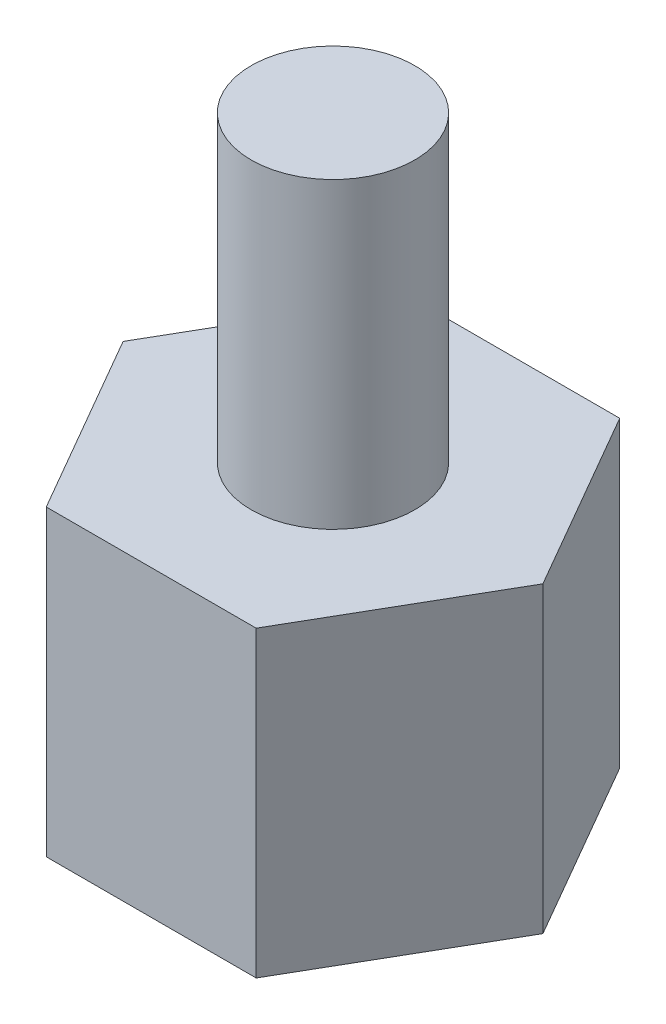
ISO-10303-21;
HEADER;
FILE_DESCRIPTION(('STEP AP214'),'2;1');
FILE_NAME('part.step','',(''),(''),'','','');
FILE_SCHEMA(('AUTOMOTIVE_DESIGN { 1 0 10303 214 1 1 1 1 }'));
ENDSEC;
DATA;
#1=APPLICATION_CONTEXT('core data for automotive mechanical design processes');
#2=APPLICATION_PROTOCOL_DEFINITION('international standard','automotive_design',2000,#1);
#3=PRODUCT_CONTEXT('',#1,'mechanical');
#4=PRODUCT('Part','Part','',(#3));
#5=PRODUCT_RELATED_PRODUCT_CATEGORY('part','',(#4));
#6=PRODUCT_DEFINITION_FORMATION('','',#4);
#7=PRODUCT_DEFINITION_CONTEXT('part definition',#1,'design');
#8=PRODUCT_DEFINITION('design','',#6,#7);
#9=PRODUCT_DEFINITION_SHAPE('','',#8);
#10=(LENGTH_UNIT() NAMED_UNIT(*) SI_UNIT(.MILLI.,.METRE.));
#11=(NAMED_UNIT(*) PLANE_ANGLE_UNIT() SI_UNIT($,.RADIAN.));
#12=(NAMED_UNIT(*) SI_UNIT($,.STERADIAN.) SOLID_ANGLE_UNIT());
#13=UNCERTAINTY_MEASURE_WITH_UNIT(LENGTH_MEASURE(1.E-05),#10,'distance_accuracy_value','');
#14=(GEOMETRIC_REPRESENTATION_CONTEXT(3) GLOBAL_UNCERTAINTY_ASSIGNED_CONTEXT((#13)) GLOBAL_UNIT_ASSIGNED_CONTEXT((#10,
#11,#12)) REPRESENTATION_CONTEXT('',''));
#15=CARTESIAN_POINT('',(0.,0.,0.));
#16=DIRECTION('',(0.,0.,1.));
#17=DIRECTION('',(1.,0.,0.));
#18=AXIS2_PLACEMENT_3D('',#15,#16,#17);
#19=CARTESIAN_POINT('',(1.73205080756891,5.,2.99999999999998));
#20=DIRECTION('',(-0.866025403784442,0.,-0.499999999999995));
#21=DIRECTION('',(-0.499999999999995,0.,0.866025403784442));
#22=AXIS2_PLACEMENT_3D('',#19,#20,#21);
#23=PLANE('',#22);
#24=DIRECTION('',(0.499999999999995,0.,-0.866025403784442));
#25=VECTOR('',#24,1.);
#26=CARTESIAN_POINT('',(1.73205080756891,0.,2.99999999999998));
#27=LINE('',#26,#25);
#28=CARTESIAN_POINT('',(1.73205080756891,0.,2.99999999999998));
#29=VERTEX_POINT('',#28);
#30=CARTESIAN_POINT('',(3.46410161513776,0.,0.));
#31=VERTEX_POINT('',#30);
#32=EDGE_CURVE('E130',#29,#31,#27,.T.);
#33=ORIENTED_EDGE('',*,*,#32,.T.);
#34=DIRECTION('',(0.,-1.,0.));
#35=VECTOR('',#34,1.);
#36=CARTESIAN_POINT('',(3.46410161513776,5.,0.));
#37=LINE('',#36,#35);
#38=CARTESIAN_POINT('',(3.46410161513776,5.,0.));
#39=VERTEX_POINT('',#38);
#40=EDGE_CURVE('E42',#39,#31,#37,.T.);
#41=ORIENTED_EDGE('',*,*,#40,.F.);
#42=DIRECTION('',(0.499999999999995,0.,-0.866025403784442));
#43=VECTOR('',#42,1.);
#44=CARTESIAN_POINT('',(1.73205080756891,5.,2.99999999999998));
#45=LINE('',#44,#43);
#46=CARTESIAN_POINT('',(1.73205080756891,5.,2.99999999999998));
#47=VERTEX_POINT('',#46);
#48=EDGE_CURVE('E147',#47,#39,#45,.T.);
#49=ORIENTED_EDGE('',*,*,#48,.F.);
#50=DIRECTION('',(0.,-1.,0.));
#51=VECTOR('',#50,1.);
#52=CARTESIAN_POINT('',(1.73205080756891,5.,2.99999999999998));
#53=LINE('',#52,#51);
#54=EDGE_CURVE('E126',#47,#29,#53,.T.);
#55=ORIENTED_EDGE('',*,*,#54,.T.);
#56=EDGE_LOOP('',(#33,#41,#49,#55));
#57=FACE_BOUND('',#56,.T.);
#58=ADVANCED_FACE('F39',(#57),#23,.F.);
#59=CARTESIAN_POINT('',(3.46410161513776,5.,0.));
#60=DIRECTION('',(-0.866025403784438,0.,0.500000000000001));
#61=DIRECTION('',(0.500000000000001,0.,0.866025403784438));
#62=AXIS2_PLACEMENT_3D('',#59,#60,#61);
#63=PLANE('',#62);
#64=DIRECTION('',(-0.500000000000001,0.,-0.866025403784438));
#65=VECTOR('',#64,1.);
#66=CARTESIAN_POINT('',(3.46410161513776,0.,0.));
#67=LINE('',#66,#65);
#68=CARTESIAN_POINT('',(1.73205080756887,0.,-3.00000000000001));
#69=VERTEX_POINT('',#68);
#70=EDGE_CURVE('E134',#31,#69,#67,.T.);
#71=ORIENTED_EDGE('',*,*,#70,.T.);
#72=DIRECTION('',(0.,-1.,0.));
#73=VECTOR('',#72,1.);
#74=CARTESIAN_POINT('',(1.73205080756887,5.,-3.00000000000001));
#75=LINE('',#74,#73);
#76=CARTESIAN_POINT('',(1.73205080756887,5.,-3.00000000000001));
#77=VERTEX_POINT('',#76);
#78=EDGE_CURVE('E153',#77,#69,#75,.T.);
#79=ORIENTED_EDGE('',*,*,#78,.F.);
#80=DIRECTION('',(-0.500000000000001,0.,-0.866025403784438));
#81=VECTOR('',#80,1.);
#82=CARTESIAN_POINT('',(3.46410161513776,5.,0.));
#83=LINE('',#82,#81);
#84=EDGE_CURVE('E95',#39,#77,#83,.T.);
#85=ORIENTED_EDGE('',*,*,#84,.F.);
#86=ORIENTED_EDGE('',*,*,#40,.T.);
#87=EDGE_LOOP('',(#71,#79,#85,#86));
#88=FACE_BOUND('',#87,.T.);
#89=ADVANCED_FACE('F160',(#88),#63,.F.);
#90=CARTESIAN_POINT('',(1.73205080756887,5.,-3.00000000000001));
#91=DIRECTION('',(0.,0.,1.));
#92=DIRECTION('',(1.,0.,0.));
#93=AXIS2_PLACEMENT_3D('',#90,#91,#92);
#94=PLANE('',#93);
#95=DIRECTION('',(-1.,0.,0.));
#96=VECTOR('',#95,1.);
#97=CARTESIAN_POINT('',(1.73205080756887,0.,-3.00000000000001));
#98=LINE('',#97,#96);
#99=CARTESIAN_POINT('',(-1.73205080756889,0.,-2.99999999999999));
#100=VERTEX_POINT('',#99);
#101=EDGE_CURVE('E138',#69,#100,#98,.T.);
#102=ORIENTED_EDGE('',*,*,#101,.T.);
#103=DIRECTION('',(0.,-1.,0.));
#104=VECTOR('',#103,1.);
#105=CARTESIAN_POINT('',(-1.73205080756889,5.,-2.99999999999999));
#106=LINE('',#105,#104);
#107=CARTESIAN_POINT('',(-1.73205080756889,5.,-2.99999999999999));
#108=VERTEX_POINT('',#107);
#109=EDGE_CURVE('E119',#108,#100,#106,.T.);
#110=ORIENTED_EDGE('',*,*,#109,.F.);
#111=DIRECTION('',(-1.,0.,0.));
#112=VECTOR('',#111,1.);
#113=CARTESIAN_POINT('',(1.73205080756887,5.,-3.00000000000001));
#114=LINE('',#113,#112);
#115=EDGE_CURVE('E108',#77,#108,#114,.T.);
#116=ORIENTED_EDGE('',*,*,#115,.F.);
#117=ORIENTED_EDGE('',*,*,#78,.T.);
#118=EDGE_LOOP('',(#102,#110,#116,#117));
#119=FACE_BOUND('',#118,.T.);
#120=ADVANCED_FACE('F166',(#119),#94,.F.);
#121=CARTESIAN_POINT('',(-1.73205080756889,5.,-2.99999999999999));
#122=DIRECTION('',(0.866025403784442,0.,0.499999999999995));
#123=DIRECTION('',(0.499999999999995,0.,-0.866025403784442));
#124=AXIS2_PLACEMENT_3D('',#121,#122,#123);
#125=PLANE('',#124);
#126=DIRECTION('',(-0.499999999999995,0.,0.866025403784442));
#127=VECTOR('',#126,1.);
#128=CARTESIAN_POINT('',(-1.73205080756889,0.,-2.99999999999999));
#129=LINE('',#128,#127);
#130=CARTESIAN_POINT('',(-3.46410161513776,0.,0.));
#131=VERTEX_POINT('',#130);
#132=EDGE_CURVE('E117',#100,#131,#129,.T.);
#133=ORIENTED_EDGE('',*,*,#132,.T.);
#134=DIRECTION('',(0.,-1.,0.));
#135=VECTOR('',#134,1.);
#136=CARTESIAN_POINT('',(-3.46410161513776,5.,0.));
#137=LINE('',#136,#135);
#138=CARTESIAN_POINT('',(-3.46410161513776,5.,0.));
#139=VERTEX_POINT('',#138);
#140=EDGE_CURVE('E114',#139,#131,#137,.T.);
#141=ORIENTED_EDGE('',*,*,#140,.F.);
#142=DIRECTION('',(-0.499999999999995,0.,0.866025403784442));
#143=VECTOR('',#142,1.);
#144=CARTESIAN_POINT('',(-1.73205080756889,5.,-2.99999999999999));
#145=LINE('',#144,#143);
#146=EDGE_CURVE('E102',#108,#139,#145,.T.);
#147=ORIENTED_EDGE('',*,*,#146,.F.);
#148=ORIENTED_EDGE('',*,*,#109,.T.);
#149=EDGE_LOOP('',(#133,#141,#147,#148));
#150=FACE_BOUND('',#149,.T.);
#151=ADVANCED_FACE('F115',(#150),#125,.F.);
#152=CARTESIAN_POINT('',(-3.46410161513776,5.,0.));
#153=DIRECTION('',(0.866025403784435,0.,-0.500000000000007));
#154=DIRECTION('',(-0.500000000000007,0.,-0.866025403784435));
#155=AXIS2_PLACEMENT_3D('',#152,#153,#154);
#156=PLANE('',#155);
#157=DIRECTION('',(0.500000000000007,0.,0.866025403784434));
#158=VECTOR('',#157,1.);
#159=CARTESIAN_POINT('',(-3.46410161513776,0.,0.));
#160=LINE('',#159,#158);
#161=CARTESIAN_POINT('',(-1.73205080756885,0.,3.00000000000002));
#162=VERTEX_POINT('',#161);
#163=EDGE_CURVE('E80',#131,#162,#160,.T.);
#164=ORIENTED_EDGE('',*,*,#163,.T.);
#165=DIRECTION('',(0.,-1.,0.));
#166=VECTOR('',#165,1.);
#167=CARTESIAN_POINT('',(-1.73205080756885,5.,3.00000000000002));
#168=LINE('',#167,#166);
#169=CARTESIAN_POINT('',(-1.73205080756885,5.,3.00000000000002));
#170=VERTEX_POINT('',#169);
#171=EDGE_CURVE('E120',#170,#162,#168,.T.);
#172=ORIENTED_EDGE('',*,*,#171,.F.);
#173=DIRECTION('',(0.500000000000007,0.,0.866025403784434));
#174=VECTOR('',#173,1.);
#175=CARTESIAN_POINT('',(-3.46410161513776,5.,0.));
#176=LINE('',#175,#174);
#177=EDGE_CURVE('E106',#139,#170,#176,.T.);
#178=ORIENTED_EDGE('',*,*,#177,.F.);
#179=ORIENTED_EDGE('',*,*,#140,.T.);
#180=EDGE_LOOP('',(#164,#172,#178,#179));
#181=FACE_BOUND('',#180,.T.);
#182=ADVANCED_FACE('F122',(#181),#156,.F.);
#183=CARTESIAN_POINT('',(-1.73205080756885,5.,3.00000000000002));
#184=DIRECTION('',(0.,0.,-1.));
#185=DIRECTION('',(-1.,0.,0.));
#186=AXIS2_PLACEMENT_3D('',#183,#184,#185);
#187=PLANE('',#186);
#188=DIRECTION('',(1.,0.,0.));
#189=VECTOR('',#188,1.);
#190=CARTESIAN_POINT('',(-1.73205080756885,0.,3.00000000000002));
#191=LINE('',#190,#189);
#192=EDGE_CURVE('E86',#162,#29,#191,.T.);
#193=ORIENTED_EDGE('',*,*,#192,.T.);
#194=ORIENTED_EDGE('',*,*,#54,.F.);
#195=DIRECTION('',(1.,0.,0.));
#196=VECTOR('',#195,1.);
#197=CARTESIAN_POINT('',(-1.73205080756885,5.,3.00000000000002));
#198=LINE('',#197,#196);
#199=EDGE_CURVE('E57',#170,#47,#198,.T.);
#200=ORIENTED_EDGE('',*,*,#199,.F.);
#201=ORIENTED_EDGE('',*,*,#171,.T.);
#202=EDGE_LOOP('',(#193,#194,#200,#201));
#203=FACE_BOUND('',#202,.T.);
#204=ADVANCED_FACE('F203',(#203),#187,.F.);
#205=CARTESIAN_POINT('',(0.,5.,0.));
#206=DIRECTION('',(0.,1.,0.));
#207=DIRECTION('',(0.,0.,1.));
#208=AXIS2_PLACEMENT_3D('',#205,#206,#207);
#209=PLANE('',#208);
#210=CARTESIAN_POINT('',(0.,5.,0.));
#211=DIRECTION('',(0.,1.,0.));
#212=DIRECTION('',(0.,0.,1.));
#213=AXIS2_PLACEMENT_3D('',#210,#211,#212);
#214=CIRCLE('',#213,1.35);
#215=CARTESIAN_POINT('',(0.,5.,1.35));
#216=VERTEX_POINT('',#215);
#217=EDGE_CURVE('E11',#216,#216,#214,.T.);
#218=ORIENTED_EDGE('',*,*,#217,.F.);
#219=EDGE_LOOP('',(#218));
#220=FACE_BOUND('',#219,.T.);
#221=ORIENTED_EDGE('',*,*,#48,.T.);
#222=ORIENTED_EDGE('',*,*,#84,.T.);
#223=ORIENTED_EDGE('',*,*,#115,.T.);
#224=ORIENTED_EDGE('',*,*,#146,.T.);
#225=ORIENTED_EDGE('',*,*,#177,.T.);
#226=ORIENTED_EDGE('',*,*,#199,.T.);
#227=EDGE_LOOP('',(#221,#222,#223,#224,#225,#226));
#228=FACE_BOUND('',#227,.T.);
#229=ADVANCED_FACE('F104',(#220,#228),#209,.T.);
#230=CARTESIAN_POINT('',(0.,0.,0.));
#231=DIRECTION('',(0.,1.,0.));
#232=DIRECTION('',(0.,0.,1.));
#233=AXIS2_PLACEMENT_3D('',#230,#231,#232);
#234=PLANE('',#233);
#235=CARTESIAN_POINT('',(0.,0.,0.));
#236=DIRECTION('',(0.,-1.,0.));
#237=DIRECTION('',(0.,0.,-1.));
#238=AXIS2_PLACEMENT_3D('',#235,#236,#237);
#239=CIRCLE('',#238,1.35);
#240=CARTESIAN_POINT('',(0.,0.,-1.35));
#241=VERTEX_POINT('',#240);
#242=EDGE_CURVE('E177',#241,#241,#239,.T.);
#243=ORIENTED_EDGE('',*,*,#242,.F.);
#244=EDGE_LOOP('',(#243));
#245=FACE_BOUND('',#244,.T.);
#246=ORIENTED_EDGE('',*,*,#32,.F.);
#247=ORIENTED_EDGE('',*,*,#192,.F.);
#248=ORIENTED_EDGE('',*,*,#163,.F.);
#249=ORIENTED_EDGE('',*,*,#132,.F.);
#250=ORIENTED_EDGE('',*,*,#101,.F.);
#251=ORIENTED_EDGE('',*,*,#70,.F.);
#252=EDGE_LOOP('',(#246,#247,#248,#249,#250,#251));
#253=FACE_BOUND('',#252,.T.);
#254=ADVANCED_FACE('F165',(#245,#253),#234,.F.);
#255=CARTESIAN_POINT('',(0.,10.,0.));
#256=DIRECTION('',(0.,-1.,0.));
#257=DIRECTION('',(0.,0.,-1.));
#258=AXIS2_PLACEMENT_3D('',#255,#256,#257);
#259=CYLINDRICAL_SURFACE('',#258,1.35);
#260=CARTESIAN_POINT('',(0.,10.,0.));
#261=DIRECTION('',(0.,1.,0.));
#262=DIRECTION('',(0.,0.,1.));
#263=AXIS2_PLACEMENT_3D('',#260,#261,#262);
#264=CIRCLE('',#263,1.35);
#265=CARTESIAN_POINT('',(0.,10.,1.35));
#266=VERTEX_POINT('',#265);
#267=EDGE_CURVE('E135',#266,#266,#264,.T.);
#268=ORIENTED_EDGE('',*,*,#267,.F.);
#269=EDGE_LOOP('',(#268));
#270=FACE_BOUND('',#269,.T.);
#271=ORIENTED_EDGE('',*,*,#217,.T.);
#272=EDGE_LOOP('',(#271));
#273=FACE_BOUND('',#272,.T.);
#274=ADVANCED_FACE('F195',(#270,#273),#259,.T.);
#275=CARTESIAN_POINT('',(0.,10.,0.));
#276=DIRECTION('',(0.,1.,0.));
#277=DIRECTION('',(0.,0.,1.));
#278=AXIS2_PLACEMENT_3D('',#275,#276,#277);
#279=PLANE('',#278);
#280=ORIENTED_EDGE('',*,*,#267,.T.);
#281=EDGE_LOOP('',(#280));
#282=FACE_BOUND('',#281,.T.);
#283=ADVANCED_FACE('F190',(#282),#279,.T.);
#284=CARTESIAN_POINT('',(0.,4.,0.));
#285=DIRECTION('',(0.,-1.,0.));
#286=DIRECTION('',(0.,0.,-1.));
#287=AXIS2_PLACEMENT_3D('',#284,#285,#286);
#288=CYLINDRICAL_SURFACE('',#287,1.35);
#289=CARTESIAN_POINT('',(0.,4.,0.));
#290=DIRECTION('',(0.,-1.,0.));
#291=DIRECTION('',(0.,0.,-1.));
#292=AXIS2_PLACEMENT_3D('',#289,#290,#291);
#293=CIRCLE('',#292,1.35);
#294=CARTESIAN_POINT('',(0.,4.,-1.35));
#295=VERTEX_POINT('',#294);
#296=EDGE_CURVE('E176',#295,#295,#293,.T.);
#297=ORIENTED_EDGE('',*,*,#296,.F.);
#298=EDGE_LOOP('',(#297));
#299=FACE_BOUND('',#298,.T.);
#300=ORIENTED_EDGE('',*,*,#242,.T.);
#301=EDGE_LOOP('',(#300));
#302=FACE_BOUND('',#301,.T.);
#303=ADVANCED_FACE('F187',(#299,#302),#288,.F.);
#304=CARTESIAN_POINT('',(0.,4.,0.));
#305=DIRECTION('',(0.,-1.,0.));
#306=DIRECTION('',(0.,0.,-1.));
#307=AXIS2_PLACEMENT_3D('',#304,#305,#306);
#308=PLANE('',#307);
#309=ORIENTED_EDGE('',*,*,#296,.T.);
#310=EDGE_LOOP('',(#309));
#311=FACE_BOUND('',#310,.T.);
#312=ADVANCED_FACE('F185',(#311),#308,.T.);
#313=CLOSED_SHELL('',(#58,#89,#120,#151,#182,#204,#229,#254,#274,#283,#303,#312));
#314=MANIFOLD_SOLID_BREP('B2',#313);
#315=ADVANCED_BREP_SHAPE_REPRESENTATION('',(#18,#314),#14);
#316=SHAPE_DEFINITION_REPRESENTATION(#9,#315);
ENDSEC;
END-ISO-10303-21;
